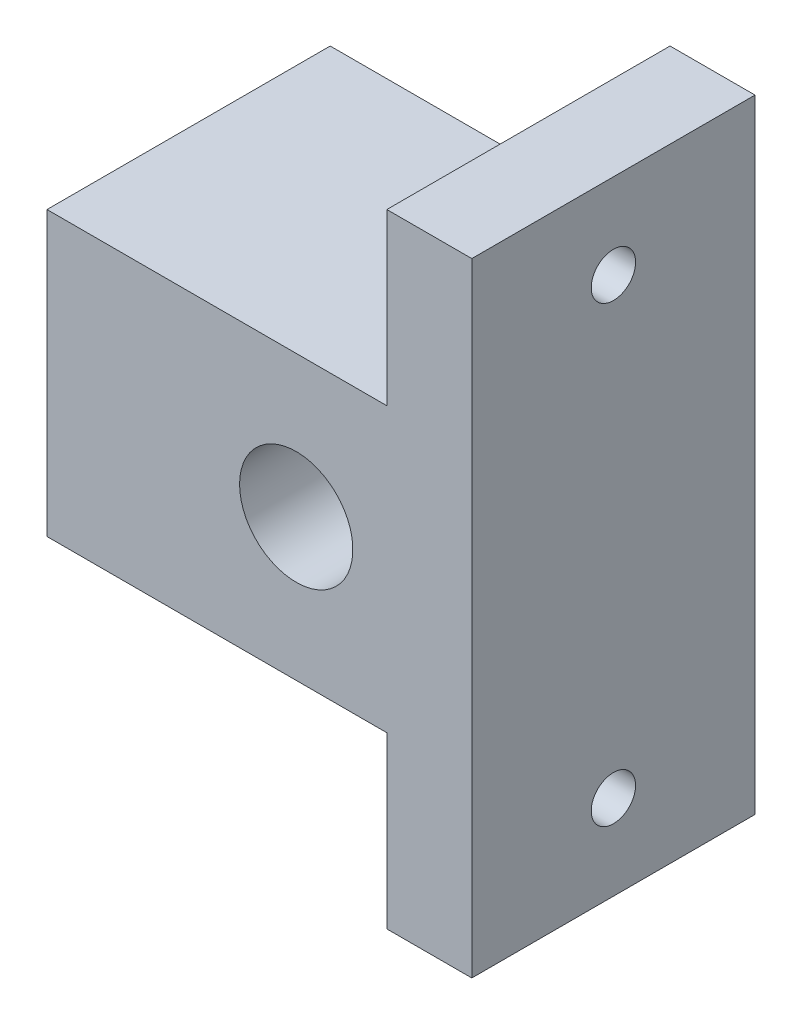
ISO-10303-21;
HEADER;
FILE_DESCRIPTION(('STEP AP214'),'2;1');
FILE_NAME('part.step','',(''),(''),'','','');
FILE_SCHEMA(('AUTOMOTIVE_DESIGN { 1 0 10303 214 1 1 1 1 }'));
ENDSEC;
DATA;
#1=APPLICATION_CONTEXT('core data for automotive mechanical design processes');
#2=APPLICATION_PROTOCOL_DEFINITION('international standard','automotive_design',2000,#1);
#3=PRODUCT_CONTEXT('',#1,'mechanical');
#4=PRODUCT('Part','Part','',(#3));
#5=PRODUCT_RELATED_PRODUCT_CATEGORY('part','',(#4));
#6=PRODUCT_DEFINITION_FORMATION('','',#4);
#7=PRODUCT_DEFINITION_CONTEXT('part definition',#1,'design');
#8=PRODUCT_DEFINITION('design','',#6,#7);
#9=PRODUCT_DEFINITION_SHAPE('','',#8);
#10=(LENGTH_UNIT() NAMED_UNIT(*) SI_UNIT(.MILLI.,.METRE.));
#11=(NAMED_UNIT(*) PLANE_ANGLE_UNIT() SI_UNIT($,.RADIAN.));
#12=(NAMED_UNIT(*) SI_UNIT($,.STERADIAN.) SOLID_ANGLE_UNIT());
#13=UNCERTAINTY_MEASURE_WITH_UNIT(LENGTH_MEASURE(1.E-05),#10,'distance_accuracy_value','');
#14=(GEOMETRIC_REPRESENTATION_CONTEXT(3) GLOBAL_UNCERTAINTY_ASSIGNED_CONTEXT((#13)) GLOBAL_UNIT_ASSIGNED_CONTEXT((#10,
#11,#12)) REPRESENTATION_CONTEXT('',''));
#15=CARTESIAN_POINT('',(0.,0.,0.));
#16=DIRECTION('',(0.,0.,1.));
#17=DIRECTION('',(1.,0.,0.));
#18=AXIS2_PLACEMENT_3D('',#15,#16,#17);
#19=CARTESIAN_POINT('',(-32.5,-11.,25.));
#20=DIRECTION('',(0.,-1.,0.));
#21=DIRECTION('',(0.,0.,-1.));
#22=AXIS2_PLACEMENT_3D('',#19,#20,#21);
#23=PLANE('',#22);
#24=DIRECTION('',(0.,0.,1.));
#25=VECTOR('',#24,1.);
#26=CARTESIAN_POINT('',(-35.5,-11.,15.));
#27=LINE('',#26,#25);
#28=CARTESIAN_POINT('',(-35.5,-11.,15.));
#29=VERTEX_POINT('',#28);
#30=CARTESIAN_POINT('',(-35.5,-11.,25.));
#31=VERTEX_POINT('',#30);
#32=EDGE_CURVE('E99',#29,#31,#27,.T.);
#33=ORIENTED_EDGE('',*,*,#32,.F.);
#34=DIRECTION('',(-1.,0.,0.));
#35=VECTOR('',#34,1.);
#36=CARTESIAN_POINT('',(-32.5,-11.,15.));
#37=LINE('',#36,#35);
#38=CARTESIAN_POINT('',(-32.5,-11.,15.));
#39=VERTEX_POINT('',#38);
#40=EDGE_CURVE('E109',#39,#29,#37,.T.);
#41=ORIENTED_EDGE('',*,*,#40,.F.);
#42=DIRECTION('',(0.,0.,-1.));
#43=VECTOR('',#42,1.);
#44=CARTESIAN_POINT('',(-32.5,-11.,25.));
#45=LINE('',#44,#43);
#46=CARTESIAN_POINT('',(-32.5,-11.,25.));
#47=VERTEX_POINT('',#46);
#48=EDGE_CURVE('E11',#47,#39,#45,.T.);
#49=ORIENTED_EDGE('',*,*,#48,.F.);
#50=DIRECTION('',(-1.,0.,0.));
#51=VECTOR('',#50,1.);
#52=CARTESIAN_POINT('',(-32.5,-11.,25.));
#53=LINE('',#52,#51);
#54=EDGE_CURVE('E112',#47,#31,#53,.T.);
#55=ORIENTED_EDGE('',*,*,#54,.T.);
#56=EDGE_LOOP('',(#33,#41,#49,#55));
#57=FACE_BOUND('',#56,.T.);
#58=ADVANCED_FACE('F33',(#57),#23,.T.);
#59=CARTESIAN_POINT('',(-32.5,11.,25.));
#60=DIRECTION('',(1.,0.,0.));
#61=DIRECTION('',(0.,0.,-1.));
#62=AXIS2_PLACEMENT_3D('',#59,#60,#61);
#63=PLANE('',#62);
#64=CARTESIAN_POINT('',(-32.5,-8.,20.));
#65=DIRECTION('',(1.,0.,0.));
#66=DIRECTION('',(0.,0.,-1.));
#67=AXIS2_PLACEMENT_3D('',#64,#65,#66);
#68=CIRCLE('',#67,0.7835);
#69=CARTESIAN_POINT('',(-32.5,-8.,19.2165));
#70=VERTEX_POINT('',#69);
#71=EDGE_CURVE('E234',#70,#70,#68,.T.);
#72=ORIENTED_EDGE('',*,*,#71,.F.);
#73=EDGE_LOOP('',(#72));
#74=FACE_BOUND('',#73,.T.);
#75=CARTESIAN_POINT('',(-32.5,8.,20.));
#76=DIRECTION('',(1.,0.,0.));
#77=DIRECTION('',(0.,0.,-1.));
#78=AXIS2_PLACEMENT_3D('',#75,#76,#77);
#79=CIRCLE('',#78,0.783499999999996);
#80=CARTESIAN_POINT('',(-32.5,8.,19.2165));
#81=VERTEX_POINT('',#80);
#82=EDGE_CURVE('E156',#81,#81,#79,.T.);
#83=ORIENTED_EDGE('',*,*,#82,.F.);
#84=EDGE_LOOP('',(#83));
#85=FACE_BOUND('',#84,.T.);
#86=DIRECTION('',(0.,-1.,0.));
#87=VECTOR('',#86,1.);
#88=CARTESIAN_POINT('',(-32.5,11.,15.));
#89=LINE('',#88,#87);
#90=CARTESIAN_POINT('',(-32.5,11.,15.));
#91=VERTEX_POINT('',#90);
#92=EDGE_CURVE('E116',#91,#39,#89,.T.);
#93=ORIENTED_EDGE('',*,*,#92,.F.);
#94=DIRECTION('',(0.,0.,-1.));
#95=VECTOR('',#94,1.);
#96=CARTESIAN_POINT('',(-32.5,11.,25.));
#97=LINE('',#96,#95);
#98=CARTESIAN_POINT('',(-32.5,11.,25.));
#99=VERTEX_POINT('',#98);
#100=EDGE_CURVE('E36',#99,#91,#97,.T.);
#101=ORIENTED_EDGE('',*,*,#100,.F.);
#102=DIRECTION('',(0.,-1.,0.));
#103=VECTOR('',#102,1.);
#104=CARTESIAN_POINT('',(-32.5,11.,25.));
#105=LINE('',#104,#103);
#106=EDGE_CURVE('E126',#99,#47,#105,.T.);
#107=ORIENTED_EDGE('',*,*,#106,.T.);
#108=ORIENTED_EDGE('',*,*,#48,.T.);
#109=EDGE_LOOP('',(#93,#101,#107,#108));
#110=FACE_BOUND('',#109,.T.);
#111=ADVANCED_FACE('F146',(#74,#85,#110),#63,.T.);
#112=CARTESIAN_POINT('',(-47.5,11.,25.));
#113=DIRECTION('',(0.,1.,0.));
#114=DIRECTION('',(0.,0.,1.));
#115=AXIS2_PLACEMENT_3D('',#112,#113,#114);
#116=PLANE('',#115);
#117=DIRECTION('',(0.,0.,1.));
#118=VECTOR('',#117,1.);
#119=CARTESIAN_POINT('',(-35.5,11.,15.));
#120=LINE('',#119,#118);
#121=CARTESIAN_POINT('',(-35.5,11.,15.));
#122=VERTEX_POINT('',#121);
#123=CARTESIAN_POINT('',(-35.5,11.,25.));
#124=VERTEX_POINT('',#123);
#125=EDGE_CURVE('E118',#122,#124,#120,.T.);
#126=ORIENTED_EDGE('',*,*,#125,.T.);
#127=DIRECTION('',(1.,0.,0.));
#128=VECTOR('',#127,1.);
#129=CARTESIAN_POINT('',(-47.5,11.,25.));
#130=LINE('',#129,#128);
#131=EDGE_CURVE('E132',#124,#99,#130,.T.);
#132=ORIENTED_EDGE('',*,*,#131,.T.);
#133=ORIENTED_EDGE('',*,*,#100,.T.);
#134=DIRECTION('',(1.,0.,0.));
#135=VECTOR('',#134,1.);
#136=CARTESIAN_POINT('',(-47.5,11.,15.));
#137=LINE('',#136,#135);
#138=EDGE_CURVE('E120',#122,#91,#137,.T.);
#139=ORIENTED_EDGE('',*,*,#138,.F.);
#140=EDGE_LOOP('',(#126,#132,#133,#139));
#141=FACE_BOUND('',#140,.T.);
#142=ADVANCED_FACE('F145',(#141),#116,.T.);
#143=CARTESIAN_POINT('',(-47.5,-11.,25.));
#144=DIRECTION('',(-1.,0.,0.));
#145=DIRECTION('',(0.,0.,1.));
#146=AXIS2_PLACEMENT_3D('',#143,#144,#145);
#147=PLANE('',#146);
#148=DIRECTION('',(0.,0.,1.));
#149=VECTOR('',#148,1.);
#150=CARTESIAN_POINT('',(-47.5,-5.,15.));
#151=LINE('',#150,#149);
#152=CARTESIAN_POINT('',(-47.5,-5.,15.));
#153=VERTEX_POINT('',#152);
#154=CARTESIAN_POINT('',(-47.5,-5.,25.));
#155=VERTEX_POINT('',#154);
#156=EDGE_CURVE('E160',#153,#155,#151,.T.);
#157=ORIENTED_EDGE('',*,*,#156,.T.);
#158=DIRECTION('',(0.,1.,0.));
#159=VECTOR('',#158,1.);
#160=CARTESIAN_POINT('',(-47.5,-11.,25.));
#161=LINE('',#160,#159);
#162=CARTESIAN_POINT('',(-47.5,5.,25.));
#163=VERTEX_POINT('',#162);
#164=EDGE_CURVE('E130',#155,#163,#161,.T.);
#165=ORIENTED_EDGE('',*,*,#164,.T.);
#166=DIRECTION('',(0.,0.,1.));
#167=VECTOR('',#166,1.);
#168=CARTESIAN_POINT('',(-47.5,5.,15.));
#169=LINE('',#168,#167);
#170=CARTESIAN_POINT('',(-47.5,5.,15.));
#171=VERTEX_POINT('',#170);
#172=EDGE_CURVE('E135',#171,#163,#169,.T.);
#173=ORIENTED_EDGE('',*,*,#172,.F.);
#174=DIRECTION('',(0.,1.,0.));
#175=VECTOR('',#174,1.);
#176=CARTESIAN_POINT('',(-47.5,-11.,15.));
#177=LINE('',#176,#175);
#178=EDGE_CURVE('E117',#153,#171,#177,.T.);
#179=ORIENTED_EDGE('',*,*,#178,.F.);
#180=EDGE_LOOP('',(#157,#165,#173,#179));
#181=FACE_BOUND('',#180,.T.);
#182=ADVANCED_FACE('F182',(#181),#147,.T.);
#183=CARTESIAN_POINT('',(0.,0.,25.));
#184=DIRECTION('',(0.,0.,-1.));
#185=DIRECTION('',(-1.,0.,0.));
#186=AXIS2_PLACEMENT_3D('',#183,#184,#185);
#187=PLANE('',#186);
#188=CARTESIAN_POINT('',(-38.7,0.,25.));
#189=DIRECTION('',(0.,0.,-1.));
#190=DIRECTION('',(-1.,0.,0.));
#191=AXIS2_PLACEMENT_3D('',#188,#189,#190);
#192=CIRCLE('',#191,1.99999999999999);
#193=CARTESIAN_POINT('',(-40.7,0.,25.));
#194=VERTEX_POINT('',#193);
#195=EDGE_CURVE('E239',#194,#194,#192,.T.);
#196=ORIENTED_EDGE('',*,*,#195,.T.);
#197=EDGE_LOOP('',(#196));
#198=FACE_BOUND('',#197,.T.);
#199=ORIENTED_EDGE('',*,*,#164,.F.);
#200=DIRECTION('',(-1.,0.,0.));
#201=VECTOR('',#200,1.);
#202=CARTESIAN_POINT('',(-35.5,-5.,25.));
#203=LINE('',#202,#201);
#204=CARTESIAN_POINT('',(-35.5,-5.,25.));
#205=VERTEX_POINT('',#204);
#206=EDGE_CURVE('E104',#205,#155,#203,.T.);
#207=ORIENTED_EDGE('',*,*,#206,.F.);
#208=DIRECTION('',(0.,1.,0.));
#209=VECTOR('',#208,1.);
#210=CARTESIAN_POINT('',(-35.5,-11.,25.));
#211=LINE('',#210,#209);
#212=EDGE_CURVE('E151',#31,#205,#211,.T.);
#213=ORIENTED_EDGE('',*,*,#212,.F.);
#214=ORIENTED_EDGE('',*,*,#54,.F.);
#215=ORIENTED_EDGE('',*,*,#106,.F.);
#216=ORIENTED_EDGE('',*,*,#131,.F.);
#217=DIRECTION('',(0.,1.,0.));
#218=VECTOR('',#217,1.);
#219=CARTESIAN_POINT('',(-35.5,5.,25.));
#220=LINE('',#219,#218);
#221=CARTESIAN_POINT('',(-35.5,5.,25.));
#222=VERTEX_POINT('',#221);
#223=EDGE_CURVE('E168',#222,#124,#220,.T.);
#224=ORIENTED_EDGE('',*,*,#223,.F.);
#225=DIRECTION('',(1.,0.,0.));
#226=VECTOR('',#225,1.);
#227=CARTESIAN_POINT('',(-47.5,5.,25.));
#228=LINE('',#227,#226);
#229=EDGE_CURVE('E163',#163,#222,#228,.T.);
#230=ORIENTED_EDGE('',*,*,#229,.F.);
#231=EDGE_LOOP('',(#199,#207,#213,#214,#215,#216,#224,#230));
#232=FACE_BOUND('',#231,.T.);
#233=ADVANCED_FACE('F149',(#198,#232),#187,.F.);
#234=CARTESIAN_POINT('',(0.,0.,15.));
#235=DIRECTION('',(0.,0.,-1.));
#236=DIRECTION('',(-1.,0.,0.));
#237=AXIS2_PLACEMENT_3D('',#234,#235,#236);
#238=PLANE('',#237);
#239=CARTESIAN_POINT('',(-38.7,0.,15.));
#240=DIRECTION('',(0.,0.,-1.));
#241=DIRECTION('',(-1.,0.,0.));
#242=AXIS2_PLACEMENT_3D('',#239,#240,#241);
#243=CIRCLE('',#242,1.99999999999999);
#244=CARTESIAN_POINT('',(-40.7,0.,15.));
#245=VERTEX_POINT('',#244);
#246=EDGE_CURVE('E241',#245,#245,#243,.T.);
#247=ORIENTED_EDGE('',*,*,#246,.F.);
#248=EDGE_LOOP('',(#247));
#249=FACE_BOUND('',#248,.T.);
#250=DIRECTION('',(-1.,0.,0.));
#251=VECTOR('',#250,1.);
#252=CARTESIAN_POINT('',(-35.5,-5.,15.));
#253=LINE('',#252,#251);
#254=CARTESIAN_POINT('',(-35.5,-5.,15.));
#255=VERTEX_POINT('',#254);
#256=EDGE_CURVE('E47',#255,#153,#253,.T.);
#257=ORIENTED_EDGE('',*,*,#256,.T.);
#258=ORIENTED_EDGE('',*,*,#178,.T.);
#259=DIRECTION('',(1.,0.,0.));
#260=VECTOR('',#259,1.);
#261=CARTESIAN_POINT('',(-47.5,5.,15.));
#262=LINE('',#261,#260);
#263=CARTESIAN_POINT('',(-35.5,5.,15.));
#264=VERTEX_POINT('',#263);
#265=EDGE_CURVE('E165',#171,#264,#262,.T.);
#266=ORIENTED_EDGE('',*,*,#265,.T.);
#267=DIRECTION('',(0.,1.,0.));
#268=VECTOR('',#267,1.);
#269=CARTESIAN_POINT('',(-35.5,5.,15.));
#270=LINE('',#269,#268);
#271=EDGE_CURVE('E55',#264,#122,#270,.T.);
#272=ORIENTED_EDGE('',*,*,#271,.T.);
#273=ORIENTED_EDGE('',*,*,#138,.T.);
#274=ORIENTED_EDGE('',*,*,#92,.T.);
#275=ORIENTED_EDGE('',*,*,#40,.T.);
#276=DIRECTION('',(0.,1.,0.));
#277=VECTOR('',#276,1.);
#278=CARTESIAN_POINT('',(-35.5,-11.,15.));
#279=LINE('',#278,#277);
#280=EDGE_CURVE('E95',#29,#255,#279,.T.);
#281=ORIENTED_EDGE('',*,*,#280,.T.);
#282=EDGE_LOOP('',(#257,#258,#266,#272,#273,#274,#275,#281));
#283=FACE_BOUND('',#282,.T.);
#284=ADVANCED_FACE('F114',(#249,#283),#238,.T.);
#285=CARTESIAN_POINT('',(-35.5,5.,15.));
#286=DIRECTION('',(1.,0.,0.));
#287=DIRECTION('',(0.,0.,-1.));
#288=AXIS2_PLACEMENT_3D('',#285,#286,#287);
#289=PLANE('',#288);
#290=CARTESIAN_POINT('',(-35.5,8.,20.));
#291=DIRECTION('',(1.,0.,0.));
#292=DIRECTION('',(0.,0.,-1.));
#293=AXIS2_PLACEMENT_3D('',#290,#291,#292);
#294=CIRCLE('',#293,0.783499999999999);
#295=CARTESIAN_POINT('',(-35.5,8.,19.2165));
#296=VERTEX_POINT('',#295);
#297=EDGE_CURVE('E152',#296,#296,#294,.T.);
#298=ORIENTED_EDGE('',*,*,#297,.T.);
#299=EDGE_LOOP('',(#298));
#300=FACE_BOUND('',#299,.T.);
#301=ORIENTED_EDGE('',*,*,#223,.T.);
#302=ORIENTED_EDGE('',*,*,#125,.F.);
#303=ORIENTED_EDGE('',*,*,#271,.F.);
#304=DIRECTION('',(0.,0.,1.));
#305=VECTOR('',#304,1.);
#306=CARTESIAN_POINT('',(-35.5,5.,15.));
#307=LINE('',#306,#305);
#308=EDGE_CURVE('E123',#264,#222,#307,.T.);
#309=ORIENTED_EDGE('',*,*,#308,.T.);
#310=EDGE_LOOP('',(#301,#302,#303,#309));
#311=FACE_BOUND('',#310,.T.);
#312=ADVANCED_FACE('F181',(#300,#311),#289,.F.);
#313=CARTESIAN_POINT('',(-47.5,5.,15.));
#314=DIRECTION('',(0.,-1.,0.));
#315=DIRECTION('',(0.,0.,-1.));
#316=AXIS2_PLACEMENT_3D('',#313,#314,#315);
#317=PLANE('',#316);
#318=ORIENTED_EDGE('',*,*,#229,.T.);
#319=ORIENTED_EDGE('',*,*,#308,.F.);
#320=ORIENTED_EDGE('',*,*,#265,.F.);
#321=ORIENTED_EDGE('',*,*,#172,.T.);
#322=EDGE_LOOP('',(#318,#319,#320,#321));
#323=FACE_BOUND('',#322,.T.);
#324=ADVANCED_FACE('F177',(#323),#317,.F.);
#325=CARTESIAN_POINT('',(-35.5,-5.,15.));
#326=DIRECTION('',(0.,1.,0.));
#327=DIRECTION('',(0.,0.,1.));
#328=AXIS2_PLACEMENT_3D('',#325,#326,#327);
#329=PLANE('',#328);
#330=ORIENTED_EDGE('',*,*,#206,.T.);
#331=ORIENTED_EDGE('',*,*,#156,.F.);
#332=ORIENTED_EDGE('',*,*,#256,.F.);
#333=DIRECTION('',(0.,0.,1.));
#334=VECTOR('',#333,1.);
#335=CARTESIAN_POINT('',(-35.5,-5.,15.));
#336=LINE('',#335,#334);
#337=EDGE_CURVE('E101',#255,#205,#336,.T.);
#338=ORIENTED_EDGE('',*,*,#337,.T.);
#339=EDGE_LOOP('',(#330,#331,#332,#338));
#340=FACE_BOUND('',#339,.T.);
#341=ADVANCED_FACE('F183',(#340),#329,.F.);
#342=CARTESIAN_POINT('',(-35.5,-11.,15.));
#343=DIRECTION('',(1.,0.,0.));
#344=DIRECTION('',(0.,0.,-1.));
#345=AXIS2_PLACEMENT_3D('',#342,#343,#344);
#346=PLANE('',#345);
#347=CARTESIAN_POINT('',(-35.5,-8.,20.));
#348=DIRECTION('',(1.,0.,0.));
#349=DIRECTION('',(0.,0.,-1.));
#350=AXIS2_PLACEMENT_3D('',#347,#348,#349);
#351=CIRCLE('',#350,0.7835);
#352=CARTESIAN_POINT('',(-35.5,-8.,19.2165));
#353=VERTEX_POINT('',#352);
#354=EDGE_CURVE('E231',#353,#353,#351,.T.);
#355=ORIENTED_EDGE('',*,*,#354,.T.);
#356=EDGE_LOOP('',(#355));
#357=FACE_BOUND('',#356,.T.);
#358=ORIENTED_EDGE('',*,*,#212,.T.);
#359=ORIENTED_EDGE('',*,*,#337,.F.);
#360=ORIENTED_EDGE('',*,*,#280,.F.);
#361=ORIENTED_EDGE('',*,*,#32,.T.);
#362=EDGE_LOOP('',(#358,#359,#360,#361));
#363=FACE_BOUND('',#362,.T.);
#364=ADVANCED_FACE('F98',(#357,#363),#346,.F.);
#365=CARTESIAN_POINT('',(-35.5,8.,20.));
#366=DIRECTION('',(1.,0.,0.));
#367=DIRECTION('',(0.,0.,-1.));
#368=AXIS2_PLACEMENT_3D('',#365,#366,#367);
#369=CYLINDRICAL_SURFACE('',#368,0.783499999999998);
#370=ORIENTED_EDGE('',*,*,#297,.F.);
#371=EDGE_LOOP('',(#370));
#372=FACE_BOUND('',#371,.T.);
#373=ORIENTED_EDGE('',*,*,#82,.T.);
#374=EDGE_LOOP('',(#373));
#375=FACE_BOUND('',#374,.T.);
#376=ADVANCED_FACE('F190',(#372,#375),#369,.F.);
#377=CARTESIAN_POINT('',(-35.5,-8.,20.));
#378=DIRECTION('',(1.,0.,0.));
#379=DIRECTION('',(0.,0.,-1.));
#380=AXIS2_PLACEMENT_3D('',#377,#378,#379);
#381=CYLINDRICAL_SURFACE('',#380,0.7835);
#382=ORIENTED_EDGE('',*,*,#354,.F.);
#383=EDGE_LOOP('',(#382));
#384=FACE_BOUND('',#383,.T.);
#385=ORIENTED_EDGE('',*,*,#71,.T.);
#386=EDGE_LOOP('',(#385));
#387=FACE_BOUND('',#386,.T.);
#388=ADVANCED_FACE('F228',(#384,#387),#381,.F.);
#389=CARTESIAN_POINT('',(-38.7,0.,15.));
#390=DIRECTION('',(0.,0.,-1.));
#391=DIRECTION('',(-1.,0.,0.));
#392=AXIS2_PLACEMENT_3D('',#389,#390,#391);
#393=CYLINDRICAL_SURFACE('',#392,1.99999999999999);
#394=ORIENTED_EDGE('',*,*,#195,.F.);
#395=EDGE_LOOP('',(#394));
#396=FACE_BOUND('',#395,.T.);
#397=ORIENTED_EDGE('',*,*,#246,.T.);
#398=EDGE_LOOP('',(#397));
#399=FACE_BOUND('',#398,.T.);
#400=ADVANCED_FACE('F245',(#396,#399),#393,.F.);
#401=CLOSED_SHELL('',(#58,#111,#142,#182,#233,#284,#312,#324,#341,#364,#376,#388,#400));
#402=MANIFOLD_SOLID_BREP('B2',#401);
#403=ADVANCED_BREP_SHAPE_REPRESENTATION('',(#18,#402),#14);
#404=SHAPE_DEFINITION_REPRESENTATION(#9,#403);
ENDSEC;
END-ISO-10303-21;
